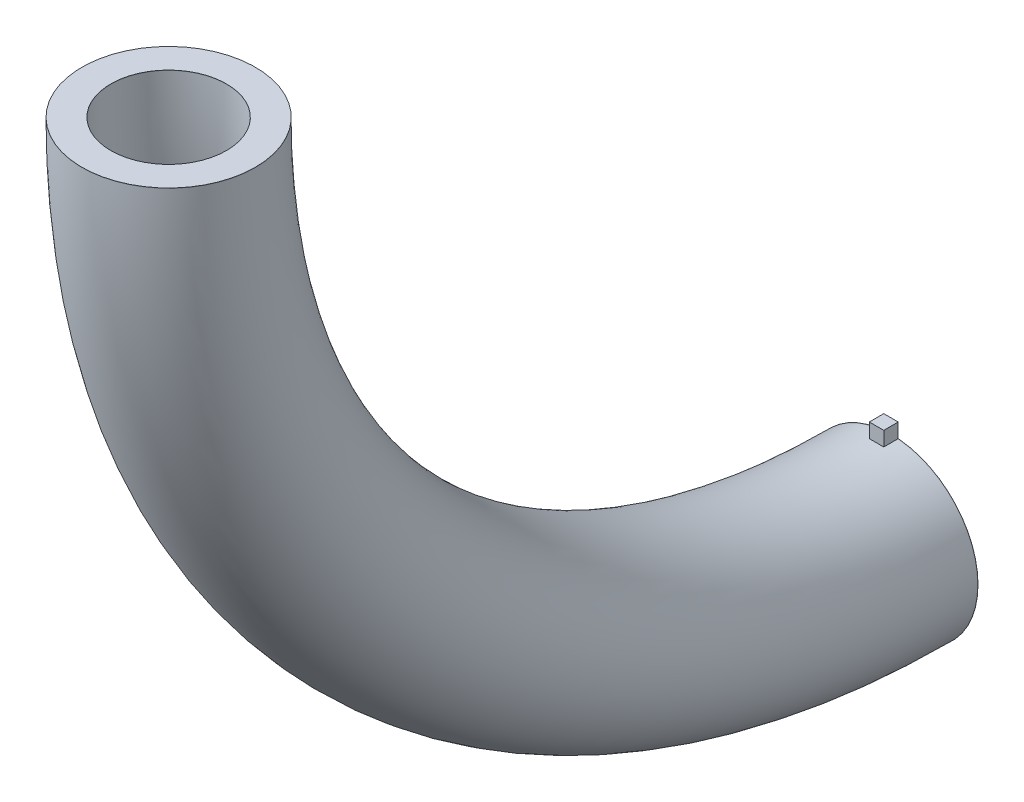
ISO-10303-21;
HEADER;
FILE_DESCRIPTION(('STEP AP214'),'2;1');
FILE_NAME('part.step','',(''),(''),'','','');
FILE_SCHEMA(('AUTOMOTIVE_DESIGN { 1 0 10303 214 1 1 1 1 }'));
ENDSEC;
DATA;
#1=APPLICATION_CONTEXT('core data for automotive mechanical design processes');
#2=APPLICATION_PROTOCOL_DEFINITION('international standard','automotive_design',2000,#1);
#3=PRODUCT_CONTEXT('',#1,'mechanical');
#4=PRODUCT('Part','Part','',(#3));
#5=PRODUCT_RELATED_PRODUCT_CATEGORY('part','',(#4));
#6=PRODUCT_DEFINITION_FORMATION('','',#4);
#7=PRODUCT_DEFINITION_CONTEXT('part definition',#1,'design');
#8=PRODUCT_DEFINITION('design','',#6,#7);
#9=PRODUCT_DEFINITION_SHAPE('','',#8);
#10=(LENGTH_UNIT() NAMED_UNIT(*) SI_UNIT(.MILLI.,.METRE.));
#11=(NAMED_UNIT(*) PLANE_ANGLE_UNIT() SI_UNIT($,.RADIAN.));
#12=(NAMED_UNIT(*) SI_UNIT($,.STERADIAN.) SOLID_ANGLE_UNIT());
#13=UNCERTAINTY_MEASURE_WITH_UNIT(LENGTH_MEASURE(1.E-05),#10,'distance_accuracy_value','');
#14=(GEOMETRIC_REPRESENTATION_CONTEXT(3) GLOBAL_UNCERTAINTY_ASSIGNED_CONTEXT((#13)) GLOBAL_UNIT_ASSIGNED_CONTEXT((#10,
#11,#12)) REPRESENTATION_CONTEXT('',''));
#15=CARTESIAN_POINT('',(0.,0.,0.));
#16=DIRECTION('',(0.,0.,1.));
#17=DIRECTION('',(1.,0.,0.));
#18=AXIS2_PLACEMENT_3D('',#15,#16,#17);
#19=CARTESIAN_POINT('',(0.,24.99,0.0100000000000031));
#20=DIRECTION('',(-1.,0.,0.));
#21=DIRECTION('',(0.,0.,1.));
#22=AXIS2_PLACEMENT_3D('',#19,#20,#21);
#23=TOROIDAL_SURFACE('',#22,24.99,3.);
#24=CARTESIAN_POINT('',(0.,24.99,25.));
#25=DIRECTION('',(0.,1.,0.));
#26=DIRECTION('',(1.,0.,0.));
#27=AXIS2_PLACEMENT_3D('',#24,#25,#26);
#28=CIRCLE('',#27,3.);
#29=CARTESIAN_POINT('',(3.,24.99,25.));
#30=VERTEX_POINT('',#29);
#31=EDGE_CURVE('E120',#30,#30,#28,.T.);
#32=ORIENTED_EDGE('',*,*,#31,.F.);
#33=EDGE_LOOP('',(#32));
#34=FACE_BOUND('',#33,.T.);
#35=CARTESIAN_POINT('',(0.,3.,0.0100000000000031));
#36=CARTESIAN_POINT('',(0.00342554449330732,3.,0.0192735635914707));
#37=CARTESIAN_POINT('',(0.00685084136542271,3.,0.0285472184627304));
#38=CARTESIAN_POINT('',(0.171966030037253,3.00000000000001,0.475617094906906));
#39=CARTESIAN_POINT('',(0.33310431921398,3.00000000000001,0.913616651955039));
#40=CARTESIAN_POINT('',(0.493690758146527,3.,1.35181963575818));
#41=B_SPLINE_CURVE_WITH_KNOTS('',3,(#35,#36,#37,#38,#39,#40),.UNSPECIFIED.,.F.,.F.,(4,2,4),(0.,
0.029658051183452,1.42975891966346),.UNSPECIFIED.);
#42=CARTESIAN_POINT('',(0.,3.,0.00999999999999959));
#43=VERTEX_POINT('',#42);
#44=CARTESIAN_POINT('',(0.184579795281542,3.,0.509999999999997));
#45=VERTEX_POINT('',#44);
#46=EDGE_CURVE('E42',#43,#45,#41,.T.);
#47=ORIENTED_EDGE('',*,*,#46,.T.);
#48=CARTESIAN_POINT('',(-0.183668776018522,3.0000560336777,0.509999999999997));
#49=CARTESIAN_POINT('',(-0.351836740163624,2.98973078827009,0.509999999999997));
#50=CARTESIAN_POINT('',(-0.51925526423866,2.96519485480377,0.509999999999997));
#51=CARTESIAN_POINT('',(-0.847734629432086,2.88833800287367,0.509999999999997));
#52=CARTESIAN_POINT('',(-1.00878756727881,2.83598364254231,0.509999999999997));
#53=CARTESIAN_POINT('',(-1.31975198217462,2.70499537628787,0.509999999999997));
#54=CARTESIAN_POINT('',(-1.4696688184106,2.62637421258899,0.509999999999997));
#55=CARTESIAN_POINT('',(-1.75413553584292,2.44510255537024,0.509999999999997));
#56=CARTESIAN_POINT('',(-1.88868921738326,2.34245802369276,0.509999999999997));
#57=CARTESIAN_POINT('',(-2.13869427535947,2.11601614155537,0.509999999999997));
#58=CARTESIAN_POINT('',(-2.25414097642403,1.99221362887486,0.509999999999997));
#59=CARTESIAN_POINT('',(-2.46262128932623,1.72698303582321,0.509999999999997));
#60=CARTESIAN_POINT('',(-2.55565399402375,1.58555424243192,0.509999999999997));
#61=CARTESIAN_POINT('',(-2.71668112366832,1.2890566857907,0.509999999999997));
#62=CARTESIAN_POINT('',(-2.78467011116084,1.13398496945321,0.509999999999997));
#63=CARTESIAN_POINT('',(-2.89365340114791,0.814629657302539,0.509999999999997));
#64=CARTESIAN_POINT('',(-2.93464773004526,0.650346070499433,0.509999999999997));
#65=CARTESIAN_POINT('',(-2.9884837300126,0.317201581339245,0.509999999999997));
#66=CARTESIAN_POINT('',(-3.00132082967457,0.148339940226288,0.509999999999997));
#67=CARTESIAN_POINT('',(-2.99846414283195,-0.189141590221283,0.509999999999997));
#68=CARTESIAN_POINT('',(-2.98277039907963,-0.357761479917772,0.509999999999997));
#69=CARTESIAN_POINT('',(-2.92329571520774,-0.689977181701852,0.509999999999997));
#70=CARTESIAN_POINT('',(-2.87951410289344,-0.85357287345289,0.509999999999997));
#71=CARTESIAN_POINT('',(-2.76510414974134,-1.17109095229014,0.509999999999997));
#72=CARTESIAN_POINT('',(-2.69447579100528,-1.32501333292724,0.509999999999997));
#73=CARTESIAN_POINT('',(-2.52838411468652,-1.61879823630326,0.509999999999997));
#74=CARTESIAN_POINT('',(-2.43292329025695,-1.75866216854217,0.509999999999997));
#75=CARTESIAN_POINT('',(-2.21987184654639,-2.02037489903682,0.509999999999997));
#76=CARTESIAN_POINT('',(-2.10228125441674,-2.14222371939522,0.509999999999997));
#77=CARTESIAN_POINT('',(-1.84832895344835,-2.36442588708443,0.509999999999997));
#78=CARTESIAN_POINT('',(-1.71197033856461,-2.46478277045884,0.509999999999997));
#79=CARTESIAN_POINT('',(-1.42433779653602,-2.64117510338958,0.509999999999997));
#80=CARTESIAN_POINT('',(-1.27306388087343,-2.71721057166909,0.509999999999997));
#81=CARTESIAN_POINT('',(-0.959921278672387,-2.84278909854716,0.509999999999997));
#82=CARTESIAN_POINT('',(-0.798054306706536,-2.89233643262125,0.509999999999997));
#83=CARTESIAN_POINT('',(-0.468299152357331,-2.9635495297812,0.509999999999997));
#84=CARTESIAN_POINT('',(-0.300410974300396,-2.98521531290038,0.509999999999997));
#85=CARTESIAN_POINT('',(0.0366021045152416,-3.00004888805047,0.509999999999997));
#86=CARTESIAN_POINT('',(0.205726874974024,-2.99321964061045,0.509999999999997));
#87=CARTESIAN_POINT('',(0.54042925116816,-2.95126391787782,0.509999999999997));
#88=CARTESIAN_POINT('',(0.706006857621861,-2.91613744831581,0.509999999999997));
#89=CARTESIAN_POINT('',(1.02891218777339,-2.81858604491135,0.509999999999997));
#90=CARTESIAN_POINT('',(1.18624004209511,-2.75616154344332,0.509999999999997));
#91=CARTESIAN_POINT('',(1.48818361901449,-2.60578742764972,0.509999999999997));
#92=CARTESIAN_POINT('',(1.63279934006323,-2.51783781021403,0.509999999999997));
#93=CARTESIAN_POINT('',(1.90522580715486,-2.31890359950034,0.509999999999997));
#94=CARTESIAN_POINT('',(2.03303526840022,-2.20791724679058,0.509999999999997));
#95=CARTESIAN_POINT('',(2.26821051727894,-1.96606524489438,0.509999999999997));
#96=CARTESIAN_POINT('',(2.37557628239613,-1.83519957381363,0.509999999999997));
#97=CARTESIAN_POINT('',(2.56683349443129,-1.55728344476827,0.509999999999997));
#98=CARTESIAN_POINT('',(2.65072147765966,-1.41023060315596,0.509999999999997));
#99=CARTESIAN_POINT('',(2.79262346920405,-1.10413048692311,0.509999999999997));
#100=CARTESIAN_POINT('',(2.85063748043178,-0.945083213652342,0.509999999999997));
#101=CARTESIAN_POINT('',(2.9391550377257,-0.619479911547179,0.509999999999997));
#102=CARTESIAN_POINT('',(2.96965388986361,-0.452922606631157,0.509999999999997));
#103=CARTESIAN_POINT('',(3.00226016016739,-0.117051435378046,0.509999999999997));
#104=CARTESIAN_POINT('',(3.00436750259385,0.0522624383114761,0.509999999999997));
#105=CARTESIAN_POINT('',(2.98012998176872,0.388863096395941,0.509999999999997));
#106=CARTESIAN_POINT('',(2.95378148851099,0.556149619416097,0.509999999999997));
#107=CARTESIAN_POINT('',(2.87337412387646,0.883925407783903,0.509999999999997));
#108=CARTESIAN_POINT('',(2.81931518681574,1.04441465701855,0.509999999999997));
#109=CARTESIAN_POINT('',(2.68501756828398,1.3540457511629,0.509999999999997));
#110=CARTESIAN_POINT('',(2.60477781203572,1.50318712990885,0.509999999999997));
#111=CARTESIAN_POINT('',(2.42039854383267,1.78587399879469,0.509999999999997));
#112=CARTESIAN_POINT('',(2.31625998043716,1.91942010760372,0.509999999999997));
#113=CARTESIAN_POINT('',(2.08706319614873,2.1671015665374,0.509999999999997));
#114=CARTESIAN_POINT('',(1.96200962971783,2.28124122403671,0.509999999999997));
#115=CARTESIAN_POINT('',(1.69447527551126,2.48692885005281,0.509999999999997));
#116=CARTESIAN_POINT('',(1.55199018287078,2.57847122106363,0.509999999999997));
#117=CARTESIAN_POINT('',(1.25364740087393,2.73634297029174,0.509999999999997));
#118=CARTESIAN_POINT('',(1.09778630569954,2.80266590361233,0.509999999999997));
#119=CARTESIAN_POINT('',(0.777264112685579,2.90811716702617,0.509999999999997));
#120=CARTESIAN_POINT('',(0.612613844403925,2.94727816807595,0.509999999999997));
#121=CARTESIAN_POINT('',(0.341871961539453,2.98800056592108,0.509999999999997));
#122=CARTESIAN_POINT('',(0.236997403724512,2.99815765651459,0.509999999999997));
#123=CARTESIAN_POINT('',(0.0267614556291072,3.00741091936775,0.509999999999997));
#124=CARTESIAN_POINT('',(-0.0785999345752935,3.00650709335549,0.509999999999997));
#125=CARTESIAN_POINT('',(-0.183668776018522,3.0000560336777,0.509999999999997));
#126=B_SPLINE_CURVE_WITH_KNOTS('',3,(#48,#49,#50,#51,#52,#53,#54,#55,#56,#57,#58,#59,#60,#61,
#62,#63,#64,#65,#66,#67,#68,#69,#70,#71,#72,#73,#74,#75,#76,#77,#78,#79,#80,#81,#82,#83,#84,#85,
#86,#87,#88,#89,#90,#91,#92,#93,#94,#95,#96,#97,#98,#99,#100,#101,#102,#103,#104,#105,#106,#107,
#108,#109,#110,#111,#112,#113,#114,#115,#116,#117,#118,#119,#120,#121,#122,#123,#124,#125),
.UNSPECIFIED.,.T.,.F.,(4,2,2,2,2,2,2,2,2,2,2,2,2,2,2,2,2,2,2,2,2,2,2,2,2,2,2,2,2,2,2,2,2,2,2,2,
2,2,4),(0.,0.505069634600908,1.01074781594661,1.51618104432866,2.02148897287531,
2.52692036522318,3.03237220997489,3.5379337330808,4.04349476170878,4.54913786356589,
5.05478020773877,5.56043465332124,6.06608943601552,6.57169347108835,7.07729688583229,
7.5828170502111,8.08833682542826,8.59377497955142,9.09921277050927,9.6045980496435,
10.1099832264296,10.6153603986931,11.1207376325344,11.6261534787979,12.1315698817104,
12.6370608097136,13.1425516808318,13.648128769495,14.1537072068751,14.6593501466534,
15.1649942849962,15.6706591836971,16.1763040156976,16.6818364699622,17.1874940227768,
17.6932807110637,18.1984579682578,18.5140180091752,18.8295780007909),.UNSPECIFIED.);
#127=CARTESIAN_POINT('',(-0.184579795277978,3.,0.509999999999997));
#128=VERTEX_POINT('',#127);
#129=EDGE_CURVE('E11',#45,#128,#126,.T.);
#130=ORIENTED_EDGE('',*,*,#129,.T.);
#131=CARTESIAN_POINT('',(0.,3.,0.0100000000000031));
#132=CARTESIAN_POINT('',(-0.00342554449330732,3.,0.0192735635914707));
#133=CARTESIAN_POINT('',(-0.00685084136542271,3.,0.0285472184627304));
#134=CARTESIAN_POINT('',(-0.171966030037253,3.00000000000001,0.475617094906906));
#135=CARTESIAN_POINT('',(-0.33310431921398,3.00000000000001,0.913616651955039));
#136=CARTESIAN_POINT('',(-0.493690758146527,3.,1.35181963575818));
#137=B_SPLINE_CURVE_WITH_KNOTS('',3,(#131,#132,#133,#134,#135,#136),.UNSPECIFIED.,.F.,.F.,(4,2,
4),(0.,0.029658051183452,1.42975891966346),.UNSPECIFIED.);
#138=EDGE_CURVE('E186',#128,#43,#137,.F.);
#139=ORIENTED_EDGE('',*,*,#138,.T.);
#140=CARTESIAN_POINT('',(0.,0.,0.00999999999999959));
#141=DIRECTION('',(0.,0.,1.));
#142=DIRECTION('',(1.,0.,0.));
#143=AXIS2_PLACEMENT_3D('',#140,#141,#142);
#144=CIRCLE('',#143,3.);
#145=EDGE_CURVE('E117',#43,#43,#144,.T.);
#146=ORIENTED_EDGE('',*,*,#145,.T.);
#147=EDGE_LOOP('',(#47,#130,#139,#146));
#148=FACE_BOUND('',#147,.T.);
#149=ADVANCED_FACE('F33',(#34,#148),#23,.T.);
#150=CARTESIAN_POINT('',(0.,0.,0.));
#151=DIRECTION('',(0.,0.,1.));
#152=DIRECTION('',(0.,-1.,0.));
#153=AXIS2_PLACEMENT_3D('',#150,#151,#152);
#154=CYLINDRICAL_SURFACE('',#153,3.);
#155=ORIENTED_EDGE('',*,*,#145,.F.);
#156=EDGE_LOOP('',(#155));
#157=FACE_BOUND('',#156,.T.);
#158=CARTESIAN_POINT('',(0.,0.,0.));
#159=DIRECTION('',(0.,0.,1.));
#160=DIRECTION('',(1.,0.,0.));
#161=AXIS2_PLACEMENT_3D('',#158,#159,#160);
#162=CIRCLE('',#161,3.);
#163=CARTESIAN_POINT('',(3.,0.,0.));
#164=VERTEX_POINT('',#163);
#165=EDGE_CURVE('E55',#164,#164,#162,.T.);
#166=ORIENTED_EDGE('',*,*,#165,.T.);
#167=EDGE_LOOP('',(#166));
#168=FACE_BOUND('',#167,.T.);
#169=ADVANCED_FACE('F165',(#157,#168),#154,.T.);
#170=CARTESIAN_POINT('',(0.,24.99,25.));
#171=DIRECTION('',(0.,1.,-3.46944695195376E-13));
#172=DIRECTION('',(0.,3.46944695195376E-13,1.));
#173=AXIS2_PLACEMENT_3D('',#170,#171,#172);
#174=CYLINDRICAL_SURFACE('',#173,3.);
#175=CARTESIAN_POINT('',(0.,25.,25.));
#176=DIRECTION('',(0.,1.,-4.18646636786998E-13));
#177=DIRECTION('',(1.,0.,0.));
#178=AXIS2_PLACEMENT_3D('',#175,#176,#177);
#179=CIRCLE('',#178,3.);
#180=CARTESIAN_POINT('',(3.,25.,25.));
#181=VERTEX_POINT('',#180);
#182=EDGE_CURVE('E199',#181,#181,#179,.T.);
#183=ORIENTED_EDGE('',*,*,#182,.F.);
#184=EDGE_LOOP('',(#183));
#185=FACE_BOUND('',#184,.T.);
#186=ORIENTED_EDGE('',*,*,#31,.T.);
#187=EDGE_LOOP('',(#186));
#188=FACE_BOUND('',#187,.T.);
#189=ADVANCED_FACE('F35',(#185,#188),#174,.T.);
#190=CARTESIAN_POINT('',(0.,0.,0.));
#191=DIRECTION('',(0.,0.,1.));
#192=DIRECTION('',(1.,0.,0.));
#193=AXIS2_PLACEMENT_3D('',#190,#191,#192);
#194=PLANE('',#193);
#195=CARTESIAN_POINT('',(0.,0.,0.));
#196=DIRECTION('',(0.,0.,1.));
#197=DIRECTION('',(1.,0.,0.));
#198=AXIS2_PLACEMENT_3D('',#195,#196,#197);
#199=CIRCLE('',#198,2.);
#200=CARTESIAN_POINT('',(2.,0.,0.));
#201=VERTEX_POINT('',#200);
#202=EDGE_CURVE('E202',#201,#201,#199,.F.);
#203=ORIENTED_EDGE('',*,*,#202,.F.);
#204=EDGE_LOOP('',(#203));
#205=FACE_BOUND('',#204,.T.);
#206=ORIENTED_EDGE('',*,*,#165,.F.);
#207=EDGE_LOOP('',(#206));
#208=FACE_BOUND('',#207,.T.);
#209=ADVANCED_FACE('F249',(#205,#208),#194,.F.);
#210=CARTESIAN_POINT('',(0.,25.,25.));
#211=DIRECTION('',(0.,1.,-4.18646636786998E-13));
#212=DIRECTION('',(1.,0.,0.));
#213=AXIS2_PLACEMENT_3D('',#210,#211,#212);
#214=PLANE('',#213);
#215=CARTESIAN_POINT('',(0.,25.,25.));
#216=DIRECTION('',(0.,1.,-4.18646636786998E-13));
#217=DIRECTION('',(1.,0.,0.));
#218=AXIS2_PLACEMENT_3D('',#215,#216,#217);
#219=CIRCLE('',#218,2.);
#220=CARTESIAN_POINT('',(2.,25.,25.));
#221=VERTEX_POINT('',#220);
#222=EDGE_CURVE('E188',#221,#221,#219,.F.);
#223=ORIENTED_EDGE('',*,*,#222,.T.);
#224=EDGE_LOOP('',(#223));
#225=FACE_BOUND('',#224,.T.);
#226=ORIENTED_EDGE('',*,*,#182,.T.);
#227=EDGE_LOOP('',(#226));
#228=FACE_BOUND('',#227,.T.);
#229=ADVANCED_FACE('F254',(#225,#228),#214,.T.);
#230=CARTESIAN_POINT('',(0.,0.,0.));
#231=DIRECTION('',(0.,0.,1.));
#232=DIRECTION('',(0.,-1.,0.));
#233=AXIS2_PLACEMENT_3D('',#230,#231,#232);
#234=CYLINDRICAL_SURFACE('',#233,2.);
#235=CARTESIAN_POINT('',(0.,0.,0.00999999999999959));
#236=DIRECTION('',(0.,0.,1.));
#237=DIRECTION('',(1.,0.,0.));
#238=AXIS2_PLACEMENT_3D('',#235,#236,#237);
#239=CIRCLE('',#238,2.);
#240=CARTESIAN_POINT('',(0.,-2.,0.00999999999999931));
#241=VERTEX_POINT('',#240);
#242=EDGE_CURVE('E195',#241,#241,#239,.F.);
#243=ORIENTED_EDGE('',*,*,#242,.F.);
#244=EDGE_LOOP('',(#243));
#245=FACE_BOUND('',#244,.T.);
#246=ORIENTED_EDGE('',*,*,#202,.T.);
#247=EDGE_LOOP('',(#246));
#248=FACE_BOUND('',#247,.T.);
#249=ADVANCED_FACE('F258',(#245,#248),#234,.F.);
#250=CARTESIAN_POINT('',(0.,24.99,0.0100000000000031));
#251=DIRECTION('',(-1.,0.,0.));
#252=DIRECTION('',(0.,0.,1.));
#253=AXIS2_PLACEMENT_3D('',#250,#251,#252);
#254=TOROIDAL_SURFACE('',#253,24.99,2.);
#255=CARTESIAN_POINT('',(0.,24.99,25.));
#256=DIRECTION('',(0.,1.,0.));
#257=DIRECTION('',(1.,0.,0.));
#258=AXIS2_PLACEMENT_3D('',#255,#256,#257);
#259=CIRCLE('',#258,2.);
#260=CARTESIAN_POINT('',(0.,24.99,27.));
#261=VERTEX_POINT('',#260);
#262=EDGE_CURVE('E190',#261,#261,#259,.F.);
#263=CARTESIAN_POINT('',(0.,24.99,0.0100000000000031));
#264=DIRECTION('',(-1.,0.,0.));
#265=DIRECTION('',(0.,0.,1.));
#266=AXIS2_PLACEMENT_3D('',#263,#264,#265);
#267=CIRCLE('',#266,26.99);
#268=EDGE_CURVE('',#241,#261,#267,.T.);
#269=ORIENTED_EDGE('',*,*,#242,.T.);
#270=ORIENTED_EDGE('',*,*,#262,.F.);
#271=ORIENTED_EDGE('',*,*,#268,.T.);
#272=ORIENTED_EDGE('',*,*,#268,.F.);
#273=EDGE_LOOP('',(#269,#271,#270,#272));
#274=FACE_BOUND('',#273,.T.);
#275=ADVANCED_FACE('F241',(#274),#254,.F.);
#276=CARTESIAN_POINT('',(0.,24.99,25.));
#277=DIRECTION('',(0.,1.,-3.46944695195376E-13));
#278=DIRECTION('',(0.,3.46944695195376E-13,1.));
#279=AXIS2_PLACEMENT_3D('',#276,#277,#278);
#280=CYLINDRICAL_SURFACE('',#279,2.);
#281=ORIENTED_EDGE('',*,*,#222,.F.);
#282=EDGE_LOOP('',(#281));
#283=FACE_BOUND('',#282,.T.);
#284=ORIENTED_EDGE('',*,*,#262,.T.);
#285=EDGE_LOOP('',(#284));
#286=FACE_BOUND('',#285,.T.);
#287=ADVANCED_FACE('F167',(#283,#286),#280,.F.);
#288=CARTESIAN_POINT('',(0.25,3.,0.00999999999999739));
#289=DIRECTION('',(0.,1.,0.));
#290=DIRECTION('',(0.,0.,1.));
#291=AXIS2_PLACEMENT_3D('',#288,#289,#290);
#292=PLANE('',#291);
#293=ORIENTED_EDGE('',*,*,#46,.F.);
#294=DIRECTION('',(-1.,0.,0.));
#295=VECTOR('',#294,1.);
#296=CARTESIAN_POINT('',(0.25,3.,0.00999999999999739));
#297=LINE('',#296,#295);
#298=CARTESIAN_POINT('',(0.25,3.,0.00999999999999739));
#299=VERTEX_POINT('',#298);
#300=EDGE_CURVE('E49',#299,#43,#297,.T.);
#301=ORIENTED_EDGE('',*,*,#300,.F.);
#302=DIRECTION('',(0.,0.,-1.));
#303=VECTOR('',#302,1.);
#304=CARTESIAN_POINT('',(0.25,3.,0.00999999999999739));
#305=LINE('',#304,#303);
#306=CARTESIAN_POINT('',(0.25,3.,0.509999999999997));
#307=VERTEX_POINT('',#306);
#308=EDGE_CURVE('E111',#307,#299,#305,.T.);
#309=ORIENTED_EDGE('',*,*,#308,.F.);
#310=DIRECTION('',(-1.,0.,0.));
#311=VECTOR('',#310,1.);
#312=CARTESIAN_POINT('',(0.25,3.,0.509999999999997));
#313=LINE('',#312,#311);
#314=EDGE_CURVE('E122',#307,#45,#313,.T.);
#315=ORIENTED_EDGE('',*,*,#314,.T.);
#316=EDGE_LOOP('',(#293,#301,#309,#315));
#317=FACE_BOUND('',#316,.T.);
#318=ADVANCED_FACE('F209',(#317),#292,.F.);
#319=CARTESIAN_POINT('',(0.25,3.,0.00999999999999739));
#320=DIRECTION('',(0.,0.,1.));
#321=DIRECTION('',(1.,0.,0.));
#322=AXIS2_PLACEMENT_3D('',#319,#320,#321);
#323=PLANE('',#322);
#324=DIRECTION('',(0.,1.,0.));
#325=VECTOR('',#324,1.);
#326=CARTESIAN_POINT('',(-0.25,3.,0.00999999999999739));
#327=LINE('',#326,#325);
#328=CARTESIAN_POINT('',(-0.25,3.,0.00999999999999739));
#329=VERTEX_POINT('',#328);
#330=CARTESIAN_POINT('',(-0.25,3.5,0.00999999999999739));
#331=VERTEX_POINT('',#330);
#332=EDGE_CURVE('E116',#329,#331,#327,.T.);
#333=ORIENTED_EDGE('',*,*,#332,.T.);
#334=DIRECTION('',(-1.,0.,0.));
#335=VECTOR('',#334,1.);
#336=CARTESIAN_POINT('',(0.25,3.5,0.00999999999999739));
#337=LINE('',#336,#335);
#338=CARTESIAN_POINT('',(0.25,3.5,0.00999999999999739));
#339=VERTEX_POINT('',#338);
#340=EDGE_CURVE('E100',#339,#331,#337,.T.);
#341=ORIENTED_EDGE('',*,*,#340,.F.);
#342=DIRECTION('',(0.,1.,0.));
#343=VECTOR('',#342,1.);
#344=CARTESIAN_POINT('',(0.25,3.,0.00999999999999739));
#345=LINE('',#344,#343);
#346=EDGE_CURVE('E107',#299,#339,#345,.T.);
#347=ORIENTED_EDGE('',*,*,#346,.F.);
#348=ORIENTED_EDGE('',*,*,#300,.T.);
#349=EDGE_CURVE('E214',#43,#329,#297,.T.);
#350=ORIENTED_EDGE('',*,*,#349,.T.);
#351=EDGE_LOOP('',(#333,#341,#347,#348,#350));
#352=FACE_BOUND('',#351,.T.);
#353=ADVANCED_FACE('F114',(#352),#323,.F.);
#354=CARTESIAN_POINT('',(0.25,3.5,0.00999999999999739));
#355=DIRECTION('',(0.,-1.,0.));
#356=DIRECTION('',(0.,0.,-1.));
#357=AXIS2_PLACEMENT_3D('',#354,#355,#356);
#358=PLANE('',#357);
#359=DIRECTION('',(0.,0.,1.));
#360=VECTOR('',#359,1.);
#361=CARTESIAN_POINT('',(-0.25,3.5,0.00999999999999739));
#362=LINE('',#361,#360);
#363=CARTESIAN_POINT('',(-0.25,3.5,0.509999999999997));
#364=VERTEX_POINT('',#363);
#365=EDGE_CURVE('E223',#331,#364,#362,.T.);
#366=ORIENTED_EDGE('',*,*,#365,.T.);
#367=DIRECTION('',(-1.,0.,0.));
#368=VECTOR('',#367,1.);
#369=CARTESIAN_POINT('',(0.25,3.5,0.509999999999997));
#370=LINE('',#369,#368);
#371=CARTESIAN_POINT('',(0.25,3.5,0.509999999999997));
#372=VERTEX_POINT('',#371);
#373=EDGE_CURVE('E103',#372,#364,#370,.T.);
#374=ORIENTED_EDGE('',*,*,#373,.F.);
#375=DIRECTION('',(0.,0.,1.));
#376=VECTOR('',#375,1.);
#377=CARTESIAN_POINT('',(0.25,3.5,0.00999999999999739));
#378=LINE('',#377,#376);
#379=EDGE_CURVE('E96',#339,#372,#378,.T.);
#380=ORIENTED_EDGE('',*,*,#379,.F.);
#381=ORIENTED_EDGE('',*,*,#340,.T.);
#382=EDGE_LOOP('',(#366,#374,#380,#381));
#383=FACE_BOUND('',#382,.T.);
#384=ADVANCED_FACE('F98',(#383),#358,.F.);
#385=CARTESIAN_POINT('',(0.25,3.,0.509999999999997));
#386=DIRECTION('',(0.,0.,-1.));
#387=DIRECTION('',(-1.,0.,0.));
#388=AXIS2_PLACEMENT_3D('',#385,#386,#387);
#389=PLANE('',#388);
#390=ORIENTED_EDGE('',*,*,#129,.F.);
#391=ORIENTED_EDGE('',*,*,#314,.F.);
#392=DIRECTION('',(0.,-1.,0.));
#393=VECTOR('',#392,1.);
#394=CARTESIAN_POINT('',(0.25,3.,0.509999999999997));
#395=LINE('',#394,#393);
#396=EDGE_CURVE('E106',#372,#307,#395,.T.);
#397=ORIENTED_EDGE('',*,*,#396,.F.);
#398=ORIENTED_EDGE('',*,*,#373,.T.);
#399=DIRECTION('',(0.,-1.,0.));
#400=VECTOR('',#399,1.);
#401=CARTESIAN_POINT('',(-0.25,3.,0.509999999999997));
#402=LINE('',#401,#400);
#403=CARTESIAN_POINT('',(-0.25,3.,0.509999999999997));
#404=VERTEX_POINT('',#403);
#405=EDGE_CURVE('E221',#364,#404,#402,.T.);
#406=ORIENTED_EDGE('',*,*,#405,.T.);
#407=EDGE_CURVE('E210',#128,#404,#313,.T.);
#408=ORIENTED_EDGE('',*,*,#407,.F.);
#409=EDGE_LOOP('',(#390,#391,#397,#398,#406,#408));
#410=FACE_BOUND('',#409,.T.);
#411=ADVANCED_FACE('F136',(#410),#389,.F.);
#412=ORIENTED_EDGE('',*,*,#138,.F.);
#413=ORIENTED_EDGE('',*,*,#407,.T.);
#414=DIRECTION('',(0.,0.,-1.));
#415=VECTOR('',#414,1.);
#416=CARTESIAN_POINT('',(-0.25,3.,0.00999999999999739));
#417=LINE('',#416,#415);
#418=EDGE_CURVE('E112',#404,#329,#417,.T.);
#419=ORIENTED_EDGE('',*,*,#418,.T.);
#420=ORIENTED_EDGE('',*,*,#349,.F.);
#421=EDGE_LOOP('',(#412,#413,#419,#420));
#422=FACE_BOUND('',#421,.T.);
#423=ADVANCED_FACE('F146',(#422),#292,.F.);
#424=CARTESIAN_POINT('',(0.25,0.,0.));
#425=DIRECTION('',(1.,0.,0.));
#426=DIRECTION('',(0.,0.,-1.));
#427=AXIS2_PLACEMENT_3D('',#424,#425,#426);
#428=PLANE('',#427);
#429=ORIENTED_EDGE('',*,*,#346,.T.);
#430=ORIENTED_EDGE('',*,*,#379,.T.);
#431=ORIENTED_EDGE('',*,*,#396,.T.);
#432=ORIENTED_EDGE('',*,*,#308,.T.);
#433=EDGE_LOOP('',(#429,#430,#431,#432));
#434=FACE_BOUND('',#433,.T.);
#435=ADVANCED_FACE('F109',(#434),#428,.T.);
#436=CARTESIAN_POINT('',(-0.25,0.,0.));
#437=DIRECTION('',(1.,0.,0.));
#438=DIRECTION('',(0.,0.,-1.));
#439=AXIS2_PLACEMENT_3D('',#436,#437,#438);
#440=PLANE('',#439);
#441=ORIENTED_EDGE('',*,*,#332,.F.);
#442=ORIENTED_EDGE('',*,*,#418,.F.);
#443=ORIENTED_EDGE('',*,*,#405,.F.);
#444=ORIENTED_EDGE('',*,*,#365,.F.);
#445=EDGE_LOOP('',(#441,#442,#443,#444));
#446=FACE_BOUND('',#445,.T.);
#447=ADVANCED_FACE('F230',(#446),#440,.F.);
#448=CLOSED_SHELL('',(#149,#169,#189,#209,#229,#249,#275,#287,#318,#353,#384,#411,#423,#435,#447));
#449=MANIFOLD_SOLID_BREP('B2',#448);
#450=ADVANCED_BREP_SHAPE_REPRESENTATION('',(#18,#449),#14);
#451=SHAPE_DEFINITION_REPRESENTATION(#9,#450);
ENDSEC;
END-ISO-10303-21;
